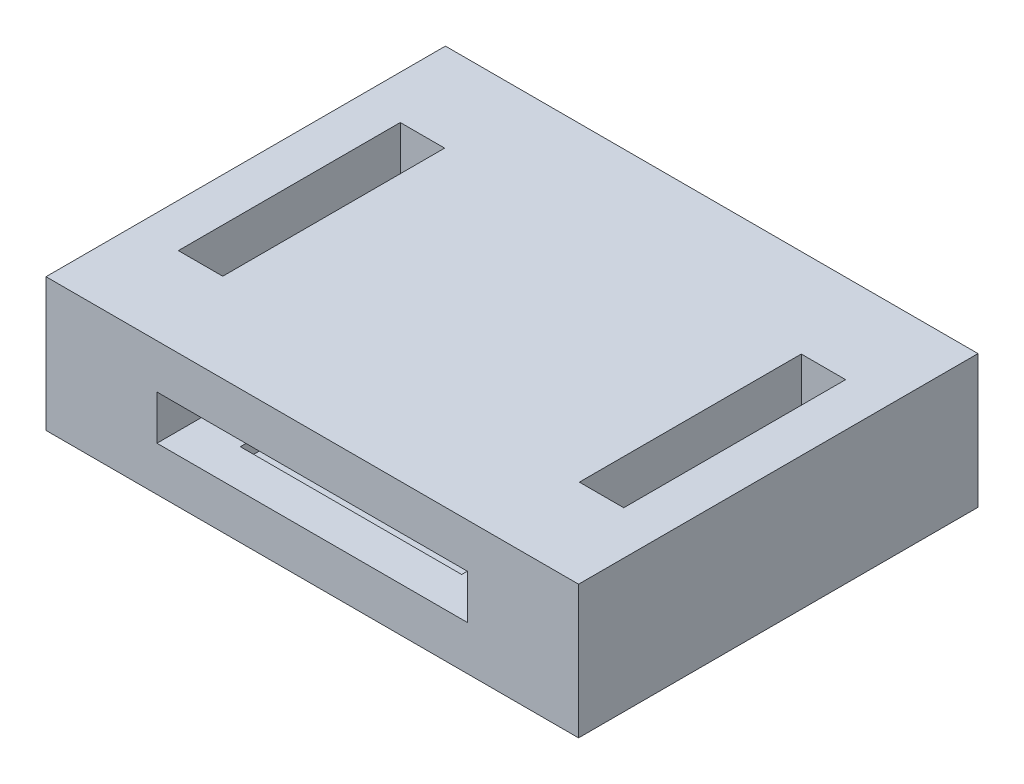
ISO-10303-21;
HEADER;
FILE_DESCRIPTION(('STEP AP214'),'2;1');
FILE_NAME('part.step','',(''),(''),'','','');
FILE_SCHEMA(('AUTOMOTIVE_DESIGN { 1 0 10303 214 1 1 1 1 }'));
ENDSEC;
DATA;
#1=APPLICATION_CONTEXT('core data for automotive mechanical design processes');
#2=APPLICATION_PROTOCOL_DEFINITION('international standard','automotive_design',2000,#1);
#3=PRODUCT_CONTEXT('',#1,'mechanical');
#4=PRODUCT('Part','Part','',(#3));
#5=PRODUCT_RELATED_PRODUCT_CATEGORY('part','',(#4));
#6=PRODUCT_DEFINITION_FORMATION('','',#4);
#7=PRODUCT_DEFINITION_CONTEXT('part definition',#1,'design');
#8=PRODUCT_DEFINITION('design','',#6,#7);
#9=PRODUCT_DEFINITION_SHAPE('','',#8);
#10=(LENGTH_UNIT() NAMED_UNIT(*) SI_UNIT(.MILLI.,.METRE.));
#11=(NAMED_UNIT(*) PLANE_ANGLE_UNIT() SI_UNIT($,.RADIAN.));
#12=(NAMED_UNIT(*) SI_UNIT($,.STERADIAN.) SOLID_ANGLE_UNIT());
#13=UNCERTAINTY_MEASURE_WITH_UNIT(LENGTH_MEASURE(1.E-05),#10,'distance_accuracy_value','');
#14=(GEOMETRIC_REPRESENTATION_CONTEXT(3) GLOBAL_UNCERTAINTY_ASSIGNED_CONTEXT((#13)) GLOBAL_UNIT_ASSIGNED_CONTEXT((#10,
#11,#12)) REPRESENTATION_CONTEXT('',''));
#15=CARTESIAN_POINT('',(0.,0.,0.));
#16=DIRECTION('',(0.,0.,1.));
#17=DIRECTION('',(1.,0.,0.));
#18=AXIS2_PLACEMENT_3D('',#15,#16,#17);
#19=CARTESIAN_POINT('',(0.,2.54,0.));
#20=DIRECTION('',(0.,-1.,0.));
#21=DIRECTION('',(0.,0.,-1.));
#22=AXIS2_PLACEMENT_3D('',#19,#20,#21);
#23=PLANE('',#22);
#24=DIRECTION('',(1.,0.,0.));
#25=VECTOR('',#24,1.);
#26=CARTESIAN_POINT('',(-6.33494104825574,2.54,9.21545269763916));
#27=LINE('',#26,#25);
#28=CARTESIAN_POINT('',(-6.33494104825574,2.54,9.21545269763916));
#29=VERTEX_POINT('',#28);
#30=CARTESIAN_POINT('',(6.33494104825578,2.54,9.21545269763916));
#31=VERTEX_POINT('',#30);
#32=EDGE_CURVE('E201',#29,#31,#27,.T.);
#33=ORIENTED_EDGE('',*,*,#32,.F.);
#34=DIRECTION('',(0.,0.,1.));
#35=VECTOR('',#34,1.);
#36=CARTESIAN_POINT('',(-6.33494104825574,2.54,1.11918866903693));
#37=LINE('',#36,#35);
#38=CARTESIAN_POINT('',(-6.33494104825574,2.54,1.11918866903693));
#39=VERTEX_POINT('',#38);
#40=EDGE_CURVE('E50',#39,#29,#37,.T.);
#41=ORIENTED_EDGE('',*,*,#40,.F.);
#42=DIRECTION('',(-1.,0.,0.));
#43=VECTOR('',#42,1.);
#44=CARTESIAN_POINT('',(-6.33494104825574,2.54,1.11918866903693));
#45=LINE('',#44,#43);
#46=CARTESIAN_POINT('',(6.33494104825578,2.54,1.11918866903693));
#47=VERTEX_POINT('',#46);
#48=EDGE_CURVE('E192',#47,#39,#45,.T.);
#49=ORIENTED_EDGE('',*,*,#48,.F.);
#50=DIRECTION('',(0.,0.,-1.));
#51=VECTOR('',#50,1.);
#52=CARTESIAN_POINT('',(6.33494104825578,2.54,1.11918866903693));
#53=LINE('',#52,#51);
#54=EDGE_CURVE('E195',#31,#47,#53,.T.);
#55=ORIENTED_EDGE('',*,*,#54,.F.);
#56=EDGE_LOOP('',(#33,#41,#49,#55));
#57=FACE_BOUND('',#56,.T.);
#58=CARTESIAN_POINT('',(-5.31894104825574,2.54,-1.27));
#59=DIRECTION('',(0.,-1.,0.));
#60=DIRECTION('',(0.,0.,-1.));
#61=AXIS2_PLACEMENT_3D('',#58,#59,#60);
#62=CIRCLE('',#61,1.016);
#63=CARTESIAN_POINT('',(-5.31894104825574,2.54,-2.286));
#64=VERTEX_POINT('',#63);
#65=EDGE_CURVE('E43',#64,#64,#62,.F.);
#66=ORIENTED_EDGE('',*,*,#65,.F.);
#67=EDGE_LOOP('',(#66));
#68=FACE_BOUND('',#67,.T.);
#69=CARTESIAN_POINT('',(5.31894104825574,2.54,-1.27));
#70=DIRECTION('',(0.,-1.,0.));
#71=DIRECTION('',(0.,0.,-1.));
#72=AXIS2_PLACEMENT_3D('',#69,#70,#71);
#73=CIRCLE('',#72,1.016);
#74=CARTESIAN_POINT('',(5.31894104825574,2.54,-2.286));
#75=VERTEX_POINT('',#74);
#76=EDGE_CURVE('E11',#75,#75,#73,.F.);
#77=ORIENTED_EDGE('',*,*,#76,.F.);
#78=EDGE_LOOP('',(#77));
#79=FACE_BOUND('',#78,.T.);
#80=DIRECTION('',(0.,0.,1.));
#81=VECTOR('',#80,1.);
#82=CARTESIAN_POINT('',(8.88999999999999,2.54,-6.35));
#83=LINE('',#82,#81);
#84=CARTESIAN_POINT('',(8.88999999999999,2.54,-6.35));
#85=VERTEX_POINT('',#84);
#86=CARTESIAN_POINT('',(8.88999999999999,2.54,11.43));
#87=VERTEX_POINT('',#86);
#88=EDGE_CURVE('E58',#85,#87,#83,.T.);
#89=ORIENTED_EDGE('',*,*,#88,.F.);
#90=DIRECTION('',(1.,0.,0.));
#91=VECTOR('',#90,1.);
#92=CARTESIAN_POINT('',(-8.89,2.54,-6.35));
#93=LINE('',#92,#91);
#94=CARTESIAN_POINT('',(-8.89,2.54,-6.35));
#95=VERTEX_POINT('',#94);
#96=EDGE_CURVE('E222',#95,#85,#93,.T.);
#97=ORIENTED_EDGE('',*,*,#96,.F.);
#98=DIRECTION('',(0.,0.,-1.));
#99=VECTOR('',#98,1.);
#100=CARTESIAN_POINT('',(-8.89,2.54,11.43));
#101=LINE('',#100,#99);
#102=CARTESIAN_POINT('',(-8.89000000000001,2.54,11.43));
#103=VERTEX_POINT('',#102);
#104=EDGE_CURVE('E219',#103,#95,#101,.T.);
#105=ORIENTED_EDGE('',*,*,#104,.F.);
#106=DIRECTION('',(1.,0.,0.));
#107=VECTOR('',#106,1.);
#108=CARTESIAN_POINT('',(-15.24,2.54,11.43));
#109=LINE('',#108,#107);
#110=EDGE_CURVE('E327',#103,#87,#109,.T.);
#111=ORIENTED_EDGE('',*,*,#110,.T.);
#112=EDGE_LOOP('',(#89,#97,#105,#111));
#113=FACE_BOUND('',#112,.T.);
#114=ADVANCED_FACE('F35',(#57,#68,#79,#113),#23,.F.);
#115=CARTESIAN_POINT('',(0.,5.08,0.));
#116=DIRECTION('',(0.,1.,0.));
#117=DIRECTION('',(0.,0.,1.));
#118=AXIS2_PLACEMENT_3D('',#115,#116,#117);
#119=PLANE('',#118);
#120=CARTESIAN_POINT('',(5.31894104825574,5.08,-1.27));
#121=DIRECTION('',(0.,1.,0.));
#122=DIRECTION('',(0.,0.,-1.));
#123=AXIS2_PLACEMENT_3D('',#120,#121,#122);
#124=CIRCLE('',#123,1.016);
#125=CARTESIAN_POINT('',(5.31894104825574,5.08,-2.286));
#126=VERTEX_POINT('',#125);
#127=EDGE_CURVE('E274',#126,#126,#124,.T.);
#128=ORIENTED_EDGE('',*,*,#127,.T.);
#129=EDGE_LOOP('',(#128));
#130=FACE_BOUND('',#129,.T.);
#131=CARTESIAN_POINT('',(-5.31894104825574,5.08,-1.27));
#132=DIRECTION('',(0.,1.,0.));
#133=DIRECTION('',(0.,0.,1.));
#134=AXIS2_PLACEMENT_3D('',#131,#132,#133);
#135=CIRCLE('',#134,1.016);
#136=CARTESIAN_POINT('',(-5.31894104825574,5.08,-0.254000000000001));
#137=VERTEX_POINT('',#136);
#138=EDGE_CURVE('E279',#137,#137,#135,.T.);
#139=ORIENTED_EDGE('',*,*,#138,.T.);
#140=EDGE_LOOP('',(#139));
#141=FACE_BOUND('',#140,.T.);
#142=DIRECTION('',(0.,0.,1.));
#143=VECTOR('',#142,1.);
#144=CARTESIAN_POINT('',(8.88999999999999,5.08,-6.35));
#145=LINE('',#144,#143);
#146=CARTESIAN_POINT('',(8.88999999999999,5.08,-6.35));
#147=VERTEX_POINT('',#146);
#148=CARTESIAN_POINT('',(8.89,5.08,11.43));
#149=VERTEX_POINT('',#148);
#150=EDGE_CURVE('E207',#147,#149,#145,.T.);
#151=ORIENTED_EDGE('',*,*,#150,.T.);
#152=DIRECTION('',(1.,0.,0.));
#153=VECTOR('',#152,1.);
#154=CARTESIAN_POINT('',(-15.24,5.08,11.43));
#155=LINE('',#154,#153);
#156=CARTESIAN_POINT('',(-8.89,5.08,11.43));
#157=VERTEX_POINT('',#156);
#158=EDGE_CURVE('E261',#157,#149,#155,.T.);
#159=ORIENTED_EDGE('',*,*,#158,.F.);
#160=DIRECTION('',(0.,0.,-1.));
#161=VECTOR('',#160,1.);
#162=CARTESIAN_POINT('',(-8.89,5.08,11.43));
#163=LINE('',#162,#161);
#164=CARTESIAN_POINT('',(-8.89,5.08,-6.35));
#165=VERTEX_POINT('',#164);
#166=EDGE_CURVE('E216',#157,#165,#163,.T.);
#167=ORIENTED_EDGE('',*,*,#166,.T.);
#168=DIRECTION('',(1.,0.,0.));
#169=VECTOR('',#168,1.);
#170=CARTESIAN_POINT('',(-8.89,5.08,-6.35));
#171=LINE('',#170,#169);
#172=EDGE_CURVE('E213',#165,#147,#171,.T.);
#173=ORIENTED_EDGE('',*,*,#172,.T.);
#174=EDGE_LOOP('',(#151,#159,#167,#173));
#175=FACE_BOUND('',#174,.T.);
#176=ADVANCED_FACE('F355',(#130,#141,#175),#119,.F.);
#177=CARTESIAN_POINT('',(0.,0.,0.));
#178=DIRECTION('',(0.,-1.,0.));
#179=DIRECTION('',(0.,0.,-1.));
#180=AXIS2_PLACEMENT_3D('',#177,#178,#179);
#181=PLANE('',#180);
#182=DIRECTION('',(0.,0.,-1.));
#183=VECTOR('',#182,1.);
#184=CARTESIAN_POINT('',(15.24,0.,11.43));
#185=LINE('',#184,#183);
#186=CARTESIAN_POINT('',(15.24,0.,11.43));
#187=VERTEX_POINT('',#186);
#188=CARTESIAN_POINT('',(15.24,0.,-11.43));
#189=VERTEX_POINT('',#188);
#190=EDGE_CURVE('E326',#187,#189,#185,.T.);
#191=ORIENTED_EDGE('',*,*,#190,.F.);
#192=DIRECTION('',(1.,0.,0.));
#193=VECTOR('',#192,1.);
#194=CARTESIAN_POINT('',(-15.24,0.,11.43));
#195=LINE('',#194,#193);
#196=CARTESIAN_POINT('',(-15.24,0.,11.43));
#197=VERTEX_POINT('',#196);
#198=EDGE_CURVE('E330',#197,#187,#195,.T.);
#199=ORIENTED_EDGE('',*,*,#198,.F.);
#200=DIRECTION('',(0.,0.,1.));
#201=VECTOR('',#200,1.);
#202=CARTESIAN_POINT('',(-15.24,0.,11.43));
#203=LINE('',#202,#201);
#204=CARTESIAN_POINT('',(-15.24,0.,-11.43));
#205=VERTEX_POINT('',#204);
#206=EDGE_CURVE('E335',#205,#197,#203,.T.);
#207=ORIENTED_EDGE('',*,*,#206,.F.);
#208=DIRECTION('',(-1.,0.,0.));
#209=VECTOR('',#208,1.);
#210=CARTESIAN_POINT('',(-15.24,0.,-11.43));
#211=LINE('',#210,#209);
#212=EDGE_CURVE('E333',#189,#205,#211,.T.);
#213=ORIENTED_EDGE('',*,*,#212,.F.);
#214=EDGE_LOOP('',(#191,#199,#207,#213));
#215=FACE_BOUND('',#214,.T.);
#216=DIRECTION('',(-1.,0.,0.));
#217=VECTOR('',#216,1.);
#218=CARTESIAN_POINT('',(-10.204898989899,0.,-6.35));
#219=LINE('',#218,#217);
#220=CARTESIAN_POINT('',(-10.204898989899,0.,-6.35));
#221=VERTEX_POINT('',#220);
#222=CARTESIAN_POINT('',(-12.744898989899,0.,-6.35));
#223=VERTEX_POINT('',#222);
#224=EDGE_CURVE('E313',#221,#223,#219,.T.);
#225=ORIENTED_EDGE('',*,*,#224,.T.);
#226=DIRECTION('',(0.,0.,1.));
#227=VECTOR('',#226,1.);
#228=CARTESIAN_POINT('',(-12.744898989899,0.,6.35));
#229=LINE('',#228,#227);
#230=CARTESIAN_POINT('',(-12.744898989899,0.,6.35));
#231=VERTEX_POINT('',#230);
#232=EDGE_CURVE('E304',#223,#231,#229,.T.);
#233=ORIENTED_EDGE('',*,*,#232,.T.);
#234=DIRECTION('',(1.,0.,0.));
#235=VECTOR('',#234,1.);
#236=CARTESIAN_POINT('',(-10.204898989899,0.,6.35));
#237=LINE('',#236,#235);
#238=CARTESIAN_POINT('',(-10.204898989899,0.,6.35));
#239=VERTEX_POINT('',#238);
#240=EDGE_CURVE('E307',#231,#239,#237,.T.);
#241=ORIENTED_EDGE('',*,*,#240,.T.);
#242=DIRECTION('',(0.,0.,-1.));
#243=VECTOR('',#242,1.);
#244=CARTESIAN_POINT('',(-10.204898989899,0.,6.35));
#245=LINE('',#244,#243);
#246=EDGE_CURVE('E310',#239,#221,#245,.T.);
#247=ORIENTED_EDGE('',*,*,#246,.T.);
#248=EDGE_LOOP('',(#225,#233,#241,#247));
#249=FACE_BOUND('',#248,.T.);
#250=DIRECTION('',(-1.,0.,0.));
#251=VECTOR('',#250,1.);
#252=CARTESIAN_POINT('',(10.204898989899,0.,-6.35));
#253=LINE('',#252,#251);
#254=CARTESIAN_POINT('',(12.744898989899,0.,-6.35));
#255=VERTEX_POINT('',#254);
#256=CARTESIAN_POINT('',(10.204898989899,0.,-6.35));
#257=VERTEX_POINT('',#256);
#258=EDGE_CURVE('E291',#255,#257,#253,.T.);
#259=ORIENTED_EDGE('',*,*,#258,.T.);
#260=DIRECTION('',(0.,0.,1.));
#261=VECTOR('',#260,1.);
#262=CARTESIAN_POINT('',(10.204898989899,0.,6.35));
#263=LINE('',#262,#261);
#264=CARTESIAN_POINT('',(10.204898989899,0.,6.35));
#265=VERTEX_POINT('',#264);
#266=EDGE_CURVE('E282',#257,#265,#263,.T.);
#267=ORIENTED_EDGE('',*,*,#266,.T.);
#268=DIRECTION('',(1.,0.,0.));
#269=VECTOR('',#268,1.);
#270=CARTESIAN_POINT('',(10.204898989899,0.,6.35));
#271=LINE('',#270,#269);
#272=CARTESIAN_POINT('',(12.744898989899,0.,6.35));
#273=VERTEX_POINT('',#272);
#274=EDGE_CURVE('E285',#265,#273,#271,.T.);
#275=ORIENTED_EDGE('',*,*,#274,.T.);
#276=DIRECTION('',(0.,0.,-1.));
#277=VECTOR('',#276,1.);
#278=CARTESIAN_POINT('',(12.744898989899,0.,6.35));
#279=LINE('',#278,#277);
#280=EDGE_CURVE('E288',#273,#255,#279,.T.);
#281=ORIENTED_EDGE('',*,*,#280,.T.);
#282=EDGE_LOOP('',(#259,#267,#275,#281));
#283=FACE_BOUND('',#282,.T.);
#284=ADVANCED_FACE('F410',(#215,#249,#283),#181,.T.);
#285=CARTESIAN_POINT('',(15.24,2.54,11.43));
#286=DIRECTION('',(-1.,0.,0.));
#287=DIRECTION('',(0.,0.,1.));
#288=AXIS2_PLACEMENT_3D('',#285,#286,#287);
#289=PLANE('',#288);
#290=ORIENTED_EDGE('',*,*,#190,.T.);
#291=DIRECTION('',(0.,-1.,0.));
#292=VECTOR('',#291,1.);
#293=CARTESIAN_POINT('',(15.24,2.54,-11.43));
#294=LINE('',#293,#292);
#295=CARTESIAN_POINT('',(15.24,7.62,-11.43));
#296=VERTEX_POINT('',#295);
#297=EDGE_CURVE('E346',#296,#189,#294,.T.);
#298=ORIENTED_EDGE('',*,*,#297,.F.);
#299=DIRECTION('',(0.,0.,-1.));
#300=VECTOR('',#299,1.);
#301=CARTESIAN_POINT('',(15.24,7.62,-11.43));
#302=LINE('',#301,#300);
#303=CARTESIAN_POINT('',(15.24,7.62,11.43));
#304=VERTEX_POINT('',#303);
#305=EDGE_CURVE('E268',#304,#296,#302,.T.);
#306=ORIENTED_EDGE('',*,*,#305,.F.);
#307=DIRECTION('',(0.,-1.,0.));
#308=VECTOR('',#307,1.);
#309=CARTESIAN_POINT('',(15.24,2.54,11.43));
#310=LINE('',#309,#308);
#311=EDGE_CURVE('E329',#304,#187,#310,.T.);
#312=ORIENTED_EDGE('',*,*,#311,.T.);
#313=EDGE_LOOP('',(#290,#298,#306,#312));
#314=FACE_BOUND('',#313,.T.);
#315=ADVANCED_FACE('F37',(#314),#289,.F.);
#316=CARTESIAN_POINT('',(-15.24,2.54,-11.43));
#317=DIRECTION('',(0.,0.,1.));
#318=DIRECTION('',(1.,0.,0.));
#319=AXIS2_PLACEMENT_3D('',#316,#317,#318);
#320=PLANE('',#319);
#321=ORIENTED_EDGE('',*,*,#212,.T.);
#322=DIRECTION('',(0.,-1.,0.));
#323=VECTOR('',#322,1.);
#324=CARTESIAN_POINT('',(-15.24,2.54,-11.43));
#325=LINE('',#324,#323);
#326=CARTESIAN_POINT('',(-15.24,7.62,-11.43));
#327=VERTEX_POINT('',#326);
#328=EDGE_CURVE('E343',#327,#205,#325,.T.);
#329=ORIENTED_EDGE('',*,*,#328,.F.);
#330=DIRECTION('',(-1.,0.,0.));
#331=VECTOR('',#330,1.);
#332=CARTESIAN_POINT('',(-15.24,7.62,-11.43));
#333=LINE('',#332,#331);
#334=EDGE_CURVE('E271',#296,#327,#333,.T.);
#335=ORIENTED_EDGE('',*,*,#334,.F.);
#336=ORIENTED_EDGE('',*,*,#297,.T.);
#337=EDGE_LOOP('',(#321,#329,#335,#336));
#338=FACE_BOUND('',#337,.T.);
#339=ADVANCED_FACE('F419',(#338),#320,.F.);
#340=CARTESIAN_POINT('',(-15.24,2.54,11.43));
#341=DIRECTION('',(1.,0.,0.));
#342=DIRECTION('',(0.,0.,-1.));
#343=AXIS2_PLACEMENT_3D('',#340,#341,#342);
#344=PLANE('',#343);
#345=ORIENTED_EDGE('',*,*,#206,.T.);
#346=DIRECTION('',(0.,-1.,0.));
#347=VECTOR('',#346,1.);
#348=CARTESIAN_POINT('',(-15.24,2.54,11.43));
#349=LINE('',#348,#347);
#350=CARTESIAN_POINT('',(-15.24,7.62,11.43));
#351=VERTEX_POINT('',#350);
#352=EDGE_CURVE('E340',#351,#197,#349,.T.);
#353=ORIENTED_EDGE('',*,*,#352,.F.);
#354=DIRECTION('',(0.,0.,1.));
#355=VECTOR('',#354,1.);
#356=CARTESIAN_POINT('',(-15.24,7.62,-11.43));
#357=LINE('',#356,#355);
#358=EDGE_CURVE('E262',#327,#351,#357,.T.);
#359=ORIENTED_EDGE('',*,*,#358,.F.);
#360=ORIENTED_EDGE('',*,*,#328,.T.);
#361=EDGE_LOOP('',(#345,#353,#359,#360));
#362=FACE_BOUND('',#361,.T.);
#363=ADVANCED_FACE('F416',(#362),#344,.F.);
#364=CARTESIAN_POINT('',(-15.24,2.54,11.43));
#365=DIRECTION('',(0.,0.,-1.));
#366=DIRECTION('',(-1.,0.,0.));
#367=AXIS2_PLACEMENT_3D('',#364,#365,#366);
#368=PLANE('',#367);
#369=ORIENTED_EDGE('',*,*,#110,.F.);
#370=DIRECTION('',(0.,-1.,0.));
#371=VECTOR('',#370,1.);
#372=CARTESIAN_POINT('',(-8.89,43.18,11.43));
#373=LINE('',#372,#371);
#374=EDGE_CURVE('E234',#157,#103,#373,.T.);
#375=ORIENTED_EDGE('',*,*,#374,.F.);
#376=ORIENTED_EDGE('',*,*,#158,.T.);
#377=DIRECTION('',(0.,-1.,0.));
#378=VECTOR('',#377,1.);
#379=CARTESIAN_POINT('',(8.89,43.18,11.43));
#380=LINE('',#379,#378);
#381=EDGE_CURVE('E226',#149,#87,#380,.T.);
#382=ORIENTED_EDGE('',*,*,#381,.T.);
#383=EDGE_LOOP('',(#369,#375,#376,#382));
#384=FACE_BOUND('',#383,.T.);
#385=ORIENTED_EDGE('',*,*,#198,.T.);
#386=ORIENTED_EDGE('',*,*,#311,.F.);
#387=DIRECTION('',(1.,0.,0.));
#388=VECTOR('',#387,1.);
#389=CARTESIAN_POINT('',(-15.24,7.62,11.43));
#390=LINE('',#389,#388);
#391=EDGE_CURVE('E265',#351,#304,#390,.T.);
#392=ORIENTED_EDGE('',*,*,#391,.F.);
#393=ORIENTED_EDGE('',*,*,#352,.T.);
#394=EDGE_LOOP('',(#385,#386,#392,#393));
#395=FACE_BOUND('',#394,.T.);
#396=ADVANCED_FACE('F407',(#384,#395),#368,.F.);
#397=CARTESIAN_POINT('',(-12.744898989899,2.54,6.35));
#398=DIRECTION('',(1.,0.,0.));
#399=DIRECTION('',(0.,0.,-1.));
#400=AXIS2_PLACEMENT_3D('',#397,#398,#399);
#401=PLANE('',#400);
#402=ORIENTED_EDGE('',*,*,#232,.F.);
#403=DIRECTION('',(0.,-1.,0.));
#404=VECTOR('',#403,1.);
#405=CARTESIAN_POINT('',(-12.744898989899,2.54,-6.35));
#406=LINE('',#405,#404);
#407=CARTESIAN_POINT('',(-12.744898989899,7.62,-6.35));
#408=VERTEX_POINT('',#407);
#409=EDGE_CURVE('E316',#408,#223,#406,.T.);
#410=ORIENTED_EDGE('',*,*,#409,.F.);
#411=DIRECTION('',(0.,0.,1.));
#412=VECTOR('',#411,1.);
#413=CARTESIAN_POINT('',(-12.744898989899,7.62,-6.35));
#414=LINE('',#413,#412);
#415=CARTESIAN_POINT('',(-12.744898989899,7.62,6.35));
#416=VERTEX_POINT('',#415);
#417=EDGE_CURVE('E249',#408,#416,#414,.T.);
#418=ORIENTED_EDGE('',*,*,#417,.T.);
#419=DIRECTION('',(0.,-1.,0.));
#420=VECTOR('',#419,1.);
#421=CARTESIAN_POINT('',(-12.744898989899,2.54,6.35));
#422=LINE('',#421,#420);
#423=EDGE_CURVE('E323',#416,#231,#422,.T.);
#424=ORIENTED_EDGE('',*,*,#423,.T.);
#425=EDGE_LOOP('',(#402,#410,#418,#424));
#426=FACE_BOUND('',#425,.T.);
#427=ADVANCED_FACE('F404',(#426),#401,.T.);
#428=CARTESIAN_POINT('',(-10.204898989899,2.54,6.35));
#429=DIRECTION('',(0.,0.,-1.));
#430=DIRECTION('',(-1.,0.,0.));
#431=AXIS2_PLACEMENT_3D('',#428,#429,#430);
#432=PLANE('',#431);
#433=ORIENTED_EDGE('',*,*,#240,.F.);
#434=ORIENTED_EDGE('',*,*,#423,.F.);
#435=DIRECTION('',(1.,0.,0.));
#436=VECTOR('',#435,1.);
#437=CARTESIAN_POINT('',(-12.744898989899,7.62,6.35));
#438=LINE('',#437,#436);
#439=CARTESIAN_POINT('',(-10.204898989899,7.62,6.35));
#440=VERTEX_POINT('',#439);
#441=EDGE_CURVE('E252',#416,#440,#438,.T.);
#442=ORIENTED_EDGE('',*,*,#441,.T.);
#443=DIRECTION('',(0.,-1.,0.));
#444=VECTOR('',#443,1.);
#445=CARTESIAN_POINT('',(-10.204898989899,2.54,6.35));
#446=LINE('',#445,#444);
#447=EDGE_CURVE('E321',#440,#239,#446,.T.);
#448=ORIENTED_EDGE('',*,*,#447,.T.);
#449=EDGE_LOOP('',(#433,#434,#442,#448));
#450=FACE_BOUND('',#449,.T.);
#451=ADVANCED_FACE('F400',(#450),#432,.T.);
#452=CARTESIAN_POINT('',(-10.204898989899,2.54,6.35));
#453=DIRECTION('',(-1.,0.,0.));
#454=DIRECTION('',(0.,0.,1.));
#455=AXIS2_PLACEMENT_3D('',#452,#453,#454);
#456=PLANE('',#455);
#457=ORIENTED_EDGE('',*,*,#246,.F.);
#458=ORIENTED_EDGE('',*,*,#447,.F.);
#459=DIRECTION('',(0.,0.,-1.));
#460=VECTOR('',#459,1.);
#461=CARTESIAN_POINT('',(-10.204898989899,7.62,-6.35));
#462=LINE('',#461,#460);
#463=CARTESIAN_POINT('',(-10.204898989899,7.62,-6.35));
#464=VERTEX_POINT('',#463);
#465=EDGE_CURVE('E255',#440,#464,#462,.T.);
#466=ORIENTED_EDGE('',*,*,#465,.T.);
#467=DIRECTION('',(0.,-1.,0.));
#468=VECTOR('',#467,1.);
#469=CARTESIAN_POINT('',(-10.204898989899,2.54,-6.35));
#470=LINE('',#469,#468);
#471=EDGE_CURVE('E319',#464,#221,#470,.T.);
#472=ORIENTED_EDGE('',*,*,#471,.T.);
#473=EDGE_LOOP('',(#457,#458,#466,#472));
#474=FACE_BOUND('',#473,.T.);
#475=ADVANCED_FACE('F396',(#474),#456,.T.);
#476=CARTESIAN_POINT('',(-10.204898989899,2.54,-6.35));
#477=DIRECTION('',(0.,0.,1.));
#478=DIRECTION('',(1.,0.,0.));
#479=AXIS2_PLACEMENT_3D('',#476,#477,#478);
#480=PLANE('',#479);
#481=ORIENTED_EDGE('',*,*,#224,.F.);
#482=ORIENTED_EDGE('',*,*,#471,.F.);
#483=DIRECTION('',(-1.,0.,0.));
#484=VECTOR('',#483,1.);
#485=CARTESIAN_POINT('',(-12.744898989899,7.62,-6.35));
#486=LINE('',#485,#484);
#487=EDGE_CURVE('E258',#464,#408,#486,.T.);
#488=ORIENTED_EDGE('',*,*,#487,.T.);
#489=ORIENTED_EDGE('',*,*,#409,.T.);
#490=EDGE_LOOP('',(#481,#482,#488,#489));
#491=FACE_BOUND('',#490,.T.);
#492=ADVANCED_FACE('F392',(#491),#480,.T.);
#493=CARTESIAN_POINT('',(10.204898989899,2.54,6.35));
#494=DIRECTION('',(1.,0.,0.));
#495=DIRECTION('',(0.,0.,-1.));
#496=AXIS2_PLACEMENT_3D('',#493,#494,#495);
#497=PLANE('',#496);
#498=ORIENTED_EDGE('',*,*,#266,.F.);
#499=DIRECTION('',(0.,-1.,0.));
#500=VECTOR('',#499,1.);
#501=CARTESIAN_POINT('',(10.204898989899,2.54,-6.35));
#502=LINE('',#501,#500);
#503=CARTESIAN_POINT('',(10.204898989899,7.62,-6.35));
#504=VERTEX_POINT('',#503);
#505=EDGE_CURVE('E294',#504,#257,#502,.T.);
#506=ORIENTED_EDGE('',*,*,#505,.F.);
#507=DIRECTION('',(0.,0.,1.));
#508=VECTOR('',#507,1.);
#509=CARTESIAN_POINT('',(10.204898989899,7.62,-6.35));
#510=LINE('',#509,#508);
#511=CARTESIAN_POINT('',(10.204898989899,7.62,6.35));
#512=VERTEX_POINT('',#511);
#513=EDGE_CURVE('E237',#504,#512,#510,.T.);
#514=ORIENTED_EDGE('',*,*,#513,.T.);
#515=DIRECTION('',(0.,-1.,0.));
#516=VECTOR('',#515,1.);
#517=CARTESIAN_POINT('',(10.204898989899,2.54,6.35));
#518=LINE('',#517,#516);
#519=EDGE_CURVE('E301',#512,#265,#518,.T.);
#520=ORIENTED_EDGE('',*,*,#519,.T.);
#521=EDGE_LOOP('',(#498,#506,#514,#520));
#522=FACE_BOUND('',#521,.T.);
#523=ADVANCED_FACE('F388',(#522),#497,.T.);
#524=CARTESIAN_POINT('',(10.204898989899,2.54,6.35));
#525=DIRECTION('',(0.,0.,-1.));
#526=DIRECTION('',(-1.,0.,0.));
#527=AXIS2_PLACEMENT_3D('',#524,#525,#526);
#528=PLANE('',#527);
#529=ORIENTED_EDGE('',*,*,#274,.F.);
#530=ORIENTED_EDGE('',*,*,#519,.F.);
#531=DIRECTION('',(1.,0.,0.));
#532=VECTOR('',#531,1.);
#533=CARTESIAN_POINT('',(10.204898989899,7.62,6.35));
#534=LINE('',#533,#532);
#535=CARTESIAN_POINT('',(12.744898989899,7.62,6.35));
#536=VERTEX_POINT('',#535);
#537=EDGE_CURVE('E240',#512,#536,#534,.T.);
#538=ORIENTED_EDGE('',*,*,#537,.T.);
#539=DIRECTION('',(0.,-1.,0.));
#540=VECTOR('',#539,1.);
#541=CARTESIAN_POINT('',(12.744898989899,2.54,6.35));
#542=LINE('',#541,#540);
#543=EDGE_CURVE('E299',#536,#273,#542,.T.);
#544=ORIENTED_EDGE('',*,*,#543,.T.);
#545=EDGE_LOOP('',(#529,#530,#538,#544));
#546=FACE_BOUND('',#545,.T.);
#547=ADVANCED_FACE('F384',(#546),#528,.T.);
#548=CARTESIAN_POINT('',(12.744898989899,2.54,6.35));
#549=DIRECTION('',(-1.,0.,0.));
#550=DIRECTION('',(0.,0.,1.));
#551=AXIS2_PLACEMENT_3D('',#548,#549,#550);
#552=PLANE('',#551);
#553=ORIENTED_EDGE('',*,*,#280,.F.);
#554=ORIENTED_EDGE('',*,*,#543,.F.);
#555=DIRECTION('',(0.,0.,-1.));
#556=VECTOR('',#555,1.);
#557=CARTESIAN_POINT('',(12.744898989899,7.62,-6.35));
#558=LINE('',#557,#556);
#559=CARTESIAN_POINT('',(12.744898989899,7.62,-6.35));
#560=VERTEX_POINT('',#559);
#561=EDGE_CURVE('E243',#536,#560,#558,.T.);
#562=ORIENTED_EDGE('',*,*,#561,.T.);
#563=DIRECTION('',(0.,-1.,0.));
#564=VECTOR('',#563,1.);
#565=CARTESIAN_POINT('',(12.744898989899,2.54,-6.35));
#566=LINE('',#565,#564);
#567=EDGE_CURVE('E297',#560,#255,#566,.T.);
#568=ORIENTED_EDGE('',*,*,#567,.T.);
#569=EDGE_LOOP('',(#553,#554,#562,#568));
#570=FACE_BOUND('',#569,.T.);
#571=ADVANCED_FACE('F380',(#570),#552,.T.);
#572=CARTESIAN_POINT('',(10.204898989899,2.54,-6.35));
#573=DIRECTION('',(0.,0.,1.));
#574=DIRECTION('',(1.,0.,0.));
#575=AXIS2_PLACEMENT_3D('',#572,#573,#574);
#576=PLANE('',#575);
#577=ORIENTED_EDGE('',*,*,#258,.F.);
#578=ORIENTED_EDGE('',*,*,#567,.F.);
#579=DIRECTION('',(-1.,0.,0.));
#580=VECTOR('',#579,1.);
#581=CARTESIAN_POINT('',(10.204898989899,7.62,-6.35));
#582=LINE('',#581,#580);
#583=EDGE_CURVE('E246',#560,#504,#582,.T.);
#584=ORIENTED_EDGE('',*,*,#583,.T.);
#585=ORIENTED_EDGE('',*,*,#505,.T.);
#586=EDGE_LOOP('',(#577,#578,#584,#585));
#587=FACE_BOUND('',#586,.T.);
#588=ADVANCED_FACE('F372',(#587),#576,.T.);
#589=CARTESIAN_POINT('',(-5.31894104825574,5.08,-1.27));
#590=DIRECTION('',(0.,-1.,0.));
#591=DIRECTION('',(0.,0.,-1.));
#592=AXIS2_PLACEMENT_3D('',#589,#590,#591);
#593=CYLINDRICAL_SURFACE('',#592,1.016);
#594=ORIENTED_EDGE('',*,*,#138,.F.);
#595=EDGE_LOOP('',(#594));
#596=FACE_BOUND('',#595,.T.);
#597=ORIENTED_EDGE('',*,*,#65,.T.);
#598=EDGE_LOOP('',(#597));
#599=FACE_BOUND('',#598,.T.);
#600=ADVANCED_FACE('F351',(#596,#599),#593,.T.);
#601=CARTESIAN_POINT('',(5.31894104825574,5.08,-1.27));
#602=DIRECTION('',(0.,-1.,0.));
#603=DIRECTION('',(0.,0.,-1.));
#604=AXIS2_PLACEMENT_3D('',#601,#602,#603);
#605=CYLINDRICAL_SURFACE('',#604,1.016);
#606=ORIENTED_EDGE('',*,*,#127,.F.);
#607=EDGE_LOOP('',(#606));
#608=FACE_BOUND('',#607,.T.);
#609=ORIENTED_EDGE('',*,*,#76,.T.);
#610=EDGE_LOOP('',(#609));
#611=FACE_BOUND('',#610,.T.);
#612=ADVANCED_FACE('F360',(#608,#611),#605,.T.);
#613=CARTESIAN_POINT('',(0.,7.62,0.));
#614=DIRECTION('',(0.,1.,0.));
#615=DIRECTION('',(0.,0.,1.));
#616=AXIS2_PLACEMENT_3D('',#613,#614,#615);
#617=PLANE('',#616);
#618=ORIENTED_EDGE('',*,*,#358,.T.);
#619=ORIENTED_EDGE('',*,*,#391,.T.);
#620=ORIENTED_EDGE('',*,*,#305,.T.);
#621=ORIENTED_EDGE('',*,*,#334,.T.);
#622=EDGE_LOOP('',(#618,#619,#620,#621));
#623=FACE_BOUND('',#622,.T.);
#624=ORIENTED_EDGE('',*,*,#441,.F.);
#625=ORIENTED_EDGE('',*,*,#417,.F.);
#626=ORIENTED_EDGE('',*,*,#487,.F.);
#627=ORIENTED_EDGE('',*,*,#465,.F.);
#628=EDGE_LOOP('',(#624,#625,#626,#627));
#629=FACE_BOUND('',#628,.T.);
#630=ORIENTED_EDGE('',*,*,#537,.F.);
#631=ORIENTED_EDGE('',*,*,#513,.F.);
#632=ORIENTED_EDGE('',*,*,#583,.F.);
#633=ORIENTED_EDGE('',*,*,#561,.F.);
#634=EDGE_LOOP('',(#630,#631,#632,#633));
#635=FACE_BOUND('',#634,.T.);
#636=ADVANCED_FACE('F362',(#623,#629,#635),#617,.T.);
#637=CARTESIAN_POINT('',(8.88999999999999,43.18,-6.35));
#638=DIRECTION('',(1.,0.,0.));
#639=DIRECTION('',(0.,0.,-1.));
#640=AXIS2_PLACEMENT_3D('',#637,#638,#639);
#641=PLANE('',#640);
#642=ORIENTED_EDGE('',*,*,#150,.F.);
#643=DIRECTION('',(0.,-1.,0.));
#644=VECTOR('',#643,1.);
#645=CARTESIAN_POINT('',(8.88999999999999,43.18,-6.35));
#646=LINE('',#645,#644);
#647=EDGE_CURVE('E229',#147,#85,#646,.T.);
#648=ORIENTED_EDGE('',*,*,#647,.T.);
#649=ORIENTED_EDGE('',*,*,#88,.T.);
#650=ORIENTED_EDGE('',*,*,#381,.F.);
#651=EDGE_LOOP('',(#642,#648,#649,#650));
#652=FACE_BOUND('',#651,.T.);
#653=ADVANCED_FACE('F369',(#652),#641,.F.);
#654=CARTESIAN_POINT('',(-8.89,43.18,-6.35));
#655=DIRECTION('',(0.,0.,-1.));
#656=DIRECTION('',(-1.,0.,0.));
#657=AXIS2_PLACEMENT_3D('',#654,#655,#656);
#658=PLANE('',#657);
#659=ORIENTED_EDGE('',*,*,#172,.F.);
#660=DIRECTION('',(0.,-1.,0.));
#661=VECTOR('',#660,1.);
#662=CARTESIAN_POINT('',(-8.89,43.18,-6.35));
#663=LINE('',#662,#661);
#664=EDGE_CURVE('E231',#165,#95,#663,.T.);
#665=ORIENTED_EDGE('',*,*,#664,.T.);
#666=ORIENTED_EDGE('',*,*,#96,.T.);
#667=ORIENTED_EDGE('',*,*,#647,.F.);
#668=EDGE_LOOP('',(#659,#665,#666,#667));
#669=FACE_BOUND('',#668,.T.);
#670=ADVANCED_FACE('F527',(#669),#658,.F.);
#671=CARTESIAN_POINT('',(-8.89,43.18,11.43));
#672=DIRECTION('',(-1.,0.,0.));
#673=DIRECTION('',(0.,0.,1.));
#674=AXIS2_PLACEMENT_3D('',#671,#672,#673);
#675=PLANE('',#674);
#676=ORIENTED_EDGE('',*,*,#166,.F.);
#677=ORIENTED_EDGE('',*,*,#374,.T.);
#678=ORIENTED_EDGE('',*,*,#104,.T.);
#679=ORIENTED_EDGE('',*,*,#664,.F.);
#680=EDGE_LOOP('',(#676,#677,#678,#679));
#681=FACE_BOUND('',#680,.T.);
#682=ADVANCED_FACE('F476',(#681),#675,.F.);
#683=CARTESIAN_POINT('',(-6.33494104825574,1.778,1.11918866903693));
#684=DIRECTION('',(-1.,0.,0.));
#685=DIRECTION('',(0.,0.,1.));
#686=AXIS2_PLACEMENT_3D('',#683,#684,#685);
#687=PLANE('',#686);
#688=ORIENTED_EDGE('',*,*,#40,.T.);
#689=DIRECTION('',(0.,1.,0.));
#690=VECTOR('',#689,1.);
#691=CARTESIAN_POINT('',(-6.33494104825574,1.778,9.21545269763916));
#692=LINE('',#691,#690);
#693=CARTESIAN_POINT('',(-6.33494104825574,1.778,9.21545269763916));
#694=VERTEX_POINT('',#693);
#695=EDGE_CURVE('E170',#694,#29,#692,.T.);
#696=ORIENTED_EDGE('',*,*,#695,.F.);
#697=DIRECTION('',(0.,0.,1.));
#698=VECTOR('',#697,1.);
#699=CARTESIAN_POINT('',(-6.33494104825574,1.778,1.11918866903693));
#700=LINE('',#699,#698);
#701=CARTESIAN_POINT('',(-6.33494104825574,1.778,1.11918866903693));
#702=VERTEX_POINT('',#701);
#703=EDGE_CURVE('E174',#702,#694,#700,.T.);
#704=ORIENTED_EDGE('',*,*,#703,.F.);
#705=DIRECTION('',(0.,1.,0.));
#706=VECTOR('',#705,1.);
#707=CARTESIAN_POINT('',(-6.33494104825574,1.778,1.11918866903693));
#708=LINE('',#707,#706);
#709=EDGE_CURVE('E205',#702,#39,#708,.T.);
#710=ORIENTED_EDGE('',*,*,#709,.T.);
#711=EDGE_LOOP('',(#688,#696,#704,#710));
#712=FACE_BOUND('',#711,.T.);
#713=ADVANCED_FACE('F172',(#712),#687,.F.);
#714=CARTESIAN_POINT('',(-6.33494104825574,1.778,1.11918866903693));
#715=DIRECTION('',(0.,0.,-1.));
#716=DIRECTION('',(-1.,0.,0.));
#717=AXIS2_PLACEMENT_3D('',#714,#715,#716);
#718=PLANE('',#717);
#719=ORIENTED_EDGE('',*,*,#48,.T.);
#720=ORIENTED_EDGE('',*,*,#709,.F.);
#721=DIRECTION('',(-1.,0.,0.));
#722=VECTOR('',#721,1.);
#723=CARTESIAN_POINT('',(-6.33494104825574,1.778,1.11918866903693));
#724=LINE('',#723,#722);
#725=CARTESIAN_POINT('',(6.33494104825578,1.778,1.11918866903693));
#726=VERTEX_POINT('',#725);
#727=EDGE_CURVE('E180',#726,#702,#724,.T.);
#728=ORIENTED_EDGE('',*,*,#727,.F.);
#729=DIRECTION('',(0.,1.,0.));
#730=VECTOR('',#729,1.);
#731=CARTESIAN_POINT('',(6.33494104825578,1.778,1.11918866903693));
#732=LINE('',#731,#730);
#733=EDGE_CURVE('E208',#726,#47,#732,.T.);
#734=ORIENTED_EDGE('',*,*,#733,.T.);
#735=EDGE_LOOP('',(#719,#720,#728,#734));
#736=FACE_BOUND('',#735,.T.);
#737=ADVANCED_FACE('F485',(#736),#718,.F.);
#738=CARTESIAN_POINT('',(6.33494104825578,1.778,1.11918866903693));
#739=DIRECTION('',(1.,0.,0.));
#740=DIRECTION('',(0.,0.,-1.));
#741=AXIS2_PLACEMENT_3D('',#738,#739,#740);
#742=PLANE('',#741);
#743=ORIENTED_EDGE('',*,*,#54,.T.);
#744=ORIENTED_EDGE('',*,*,#733,.F.);
#745=DIRECTION('',(0.,0.,-1.));
#746=VECTOR('',#745,1.);
#747=CARTESIAN_POINT('',(6.33494104825578,1.778,1.11918866903693));
#748=LINE('',#747,#746);
#749=CARTESIAN_POINT('',(6.33494104825578,1.778,9.21545269763916));
#750=VERTEX_POINT('',#749);
#751=EDGE_CURVE('E188',#750,#726,#748,.T.);
#752=ORIENTED_EDGE('',*,*,#751,.F.);
#753=DIRECTION('',(0.,1.,0.));
#754=VECTOR('',#753,1.);
#755=CARTESIAN_POINT('',(6.33494104825578,1.778,9.21545269763916));
#756=LINE('',#755,#754);
#757=EDGE_CURVE('E179',#750,#31,#756,.T.);
#758=ORIENTED_EDGE('',*,*,#757,.T.);
#759=EDGE_LOOP('',(#743,#744,#752,#758));
#760=FACE_BOUND('',#759,.T.);
#761=ADVANCED_FACE('F494',(#760),#742,.F.);
#762=CARTESIAN_POINT('',(-6.33494104825574,1.778,9.21545269763916));
#763=DIRECTION('',(0.,0.,1.));
#764=DIRECTION('',(1.,0.,0.));
#765=AXIS2_PLACEMENT_3D('',#762,#763,#764);
#766=PLANE('',#765);
#767=ORIENTED_EDGE('',*,*,#32,.T.);
#768=ORIENTED_EDGE('',*,*,#757,.F.);
#769=DIRECTION('',(1.,0.,0.));
#770=VECTOR('',#769,1.);
#771=CARTESIAN_POINT('',(-6.33494104825574,1.778,9.21545269763916));
#772=LINE('',#771,#770);
#773=EDGE_CURVE('E183',#694,#750,#772,.T.);
#774=ORIENTED_EDGE('',*,*,#773,.F.);
#775=ORIENTED_EDGE('',*,*,#695,.T.);
#776=EDGE_LOOP('',(#767,#768,#774,#775));
#777=FACE_BOUND('',#776,.T.);
#778=ADVANCED_FACE('F184',(#777),#766,.F.);
#779=CARTESIAN_POINT('',(0.,1.778,0.));
#780=DIRECTION('',(0.,1.,0.));
#781=DIRECTION('',(0.,0.,1.));
#782=AXIS2_PLACEMENT_3D('',#779,#780,#781);
#783=PLANE('',#782);
#784=ORIENTED_EDGE('',*,*,#703,.T.);
#785=ORIENTED_EDGE('',*,*,#773,.T.);
#786=ORIENTED_EDGE('',*,*,#751,.T.);
#787=ORIENTED_EDGE('',*,*,#727,.T.);
#788=EDGE_LOOP('',(#784,#785,#786,#787));
#789=FACE_BOUND('',#788,.T.);
#790=ADVANCED_FACE('F190',(#789),#783,.T.);
#791=CLOSED_SHELL('',(#114,#176,#284,#315,#339,#363,#396,#427,#451,#475,#492,#523,#547,#571,
#588,#600,#612,#636,#653,#670,#682,#713,#737,#761,#778,#790));
#792=MANIFOLD_SOLID_BREP('B2',#791);
#793=ADVANCED_BREP_SHAPE_REPRESENTATION('',(#18,#792),#14);
#794=SHAPE_DEFINITION_REPRESENTATION(#9,#793);
ENDSEC;
END-ISO-10303-21;
